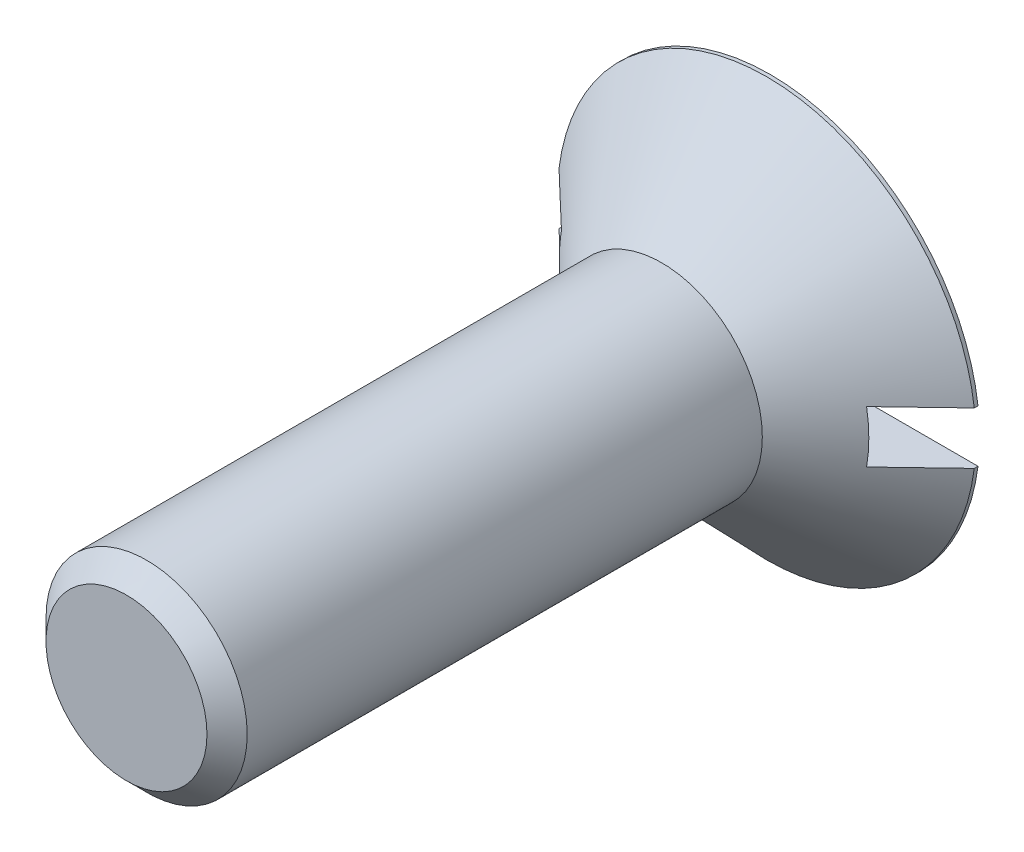
ISO-10303-21;
HEADER;
FILE_DESCRIPTION(('STEP AP214'),'2;1');
FILE_NAME('part.step','',(''),(''),'','','');
FILE_SCHEMA(('AUTOMOTIVE_DESIGN { 1 0 10303 214 1 1 1 1 }'));
ENDSEC;
DATA;
#1=APPLICATION_CONTEXT('core data for automotive mechanical design processes');
#2=APPLICATION_PROTOCOL_DEFINITION('international standard','automotive_design',2000,#1);
#3=PRODUCT_CONTEXT('',#1,'mechanical');
#4=PRODUCT('Part','Part','',(#3));
#5=PRODUCT_RELATED_PRODUCT_CATEGORY('part','',(#4));
#6=PRODUCT_DEFINITION_FORMATION('','',#4);
#7=PRODUCT_DEFINITION_CONTEXT('part definition',#1,'design');
#8=PRODUCT_DEFINITION('design','',#6,#7);
#9=PRODUCT_DEFINITION_SHAPE('','',#8);
#10=(LENGTH_UNIT() NAMED_UNIT(*) SI_UNIT(.MILLI.,.METRE.));
#11=(NAMED_UNIT(*) PLANE_ANGLE_UNIT() SI_UNIT($,.RADIAN.));
#12=(NAMED_UNIT(*) SI_UNIT($,.STERADIAN.) SOLID_ANGLE_UNIT());
#13=UNCERTAINTY_MEASURE_WITH_UNIT(LENGTH_MEASURE(1.E-05),#10,'distance_accuracy_value','');
#14=(GEOMETRIC_REPRESENTATION_CONTEXT(3) GLOBAL_UNCERTAINTY_ASSIGNED_CONTEXT((#13)) GLOBAL_UNIT_ASSIGNED_CONTEXT((#10,
#11,#12)) REPRESENTATION_CONTEXT('',''));
#15=CARTESIAN_POINT('',(0.,0.,0.));
#16=DIRECTION('',(0.,0.,1.));
#17=DIRECTION('',(1.,0.,0.));
#18=AXIS2_PLACEMENT_3D('',#15,#16,#17);
#19=CARTESIAN_POINT('',(0.,0.,-2.7));
#20=DIRECTION('',(0.,0.,1.));
#21=DIRECTION('',(1.,0.,0.));
#22=AXIS2_PLACEMENT_3D('',#19,#20,#21);
#23=PLANE('',#22);
#24=DIRECTION('',(1.,0.,0.));
#25=VECTOR('',#24,1.);
#26=CARTESIAN_POINT('',(-5.2,-0.65,-2.7));
#27=LINE('',#26,#25);
#28=CARTESIAN_POINT('',(-5.15921505657595,-0.65,-2.7));
#29=VERTEX_POINT('',#28);
#30=CARTESIAN_POINT('',(5.15921505657595,-0.65,-2.7));
#31=VERTEX_POINT('',#30);
#32=EDGE_CURVE('E126',#29,#31,#27,.T.);
#33=ORIENTED_EDGE('',*,*,#32,.T.);
#34=CARTESIAN_POINT('',(0.,0.,-2.7));
#35=DIRECTION('',(0.,0.,-1.));
#36=DIRECTION('',(-1.,0.,0.));
#37=AXIS2_PLACEMENT_3D('',#34,#35,#36);
#38=CIRCLE('',#37,5.2);
#39=EDGE_CURVE('E109',#31,#29,#38,.T.);
#40=ORIENTED_EDGE('',*,*,#39,.T.);
#41=EDGE_LOOP('',(#33,#40));
#42=FACE_BOUND('',#41,.T.);
#43=ADVANCED_FACE('F30',(#42),#23,.F.);
#44=DIRECTION('',(-1.,0.,0.));
#45=VECTOR('',#44,1.);
#46=CARTESIAN_POINT('',(-5.2,0.65,-2.7));
#47=LINE('',#46,#45);
#48=CARTESIAN_POINT('',(5.15921505657595,0.65,-2.7));
#49=VERTEX_POINT('',#48);
#50=CARTESIAN_POINT('',(-5.15921505657595,0.65,-2.7));
#51=VERTEX_POINT('',#50);
#52=EDGE_CURVE('E97',#49,#51,#47,.T.);
#53=ORIENTED_EDGE('',*,*,#52,.T.);
#54=EDGE_CURVE('E106',#51,#49,#38,.T.);
#55=ORIENTED_EDGE('',*,*,#54,.T.);
#56=EDGE_LOOP('',(#53,#55));
#57=FACE_BOUND('',#56,.T.);
#58=ADVANCED_FACE('F150',(#57),#23,.F.);
#59=CARTESIAN_POINT('',(0.,0.,0.));
#60=DIRECTION('',(0.,0.,-1.));
#61=DIRECTION('',(-1.,0.,0.));
#62=AXIS2_PLACEMENT_3D('',#59,#60,#61);
#63=CYLINDRICAL_SURFACE('',#62,5.2);
#64=DIRECTION('',(0.,0.,-1.));
#65=VECTOR('',#64,1.);
#66=CARTESIAN_POINT('',(5.15921505657595,-0.65,0.));
#67=LINE('',#66,#65);
#68=CARTESIAN_POINT('',(5.15921505657595,-0.65,-2.60735969197909));
#69=VERTEX_POINT('',#68);
#70=EDGE_CURVE('E119',#69,#31,#67,.T.);
#71=ORIENTED_EDGE('',*,*,#70,.F.);
#72=CARTESIAN_POINT('',(0.,0.,-2.60735969197909));
#73=DIRECTION('',(0.,0.,-1.));
#74=DIRECTION('',(-1.,0.,0.));
#75=AXIS2_PLACEMENT_3D('',#72,#73,#74);
#76=CIRCLE('',#75,5.2);
#77=CARTESIAN_POINT('',(-5.15921505657595,-0.65,-2.60735969197909));
#78=VERTEX_POINT('',#77);
#79=EDGE_CURVE('E116',#69,#78,#76,.T.);
#80=ORIENTED_EDGE('',*,*,#79,.T.);
#81=DIRECTION('',(0.,0.,-1.));
#82=VECTOR('',#81,1.);
#83=CARTESIAN_POINT('',(-5.15921505657595,-0.65,0.));
#84=LINE('',#83,#82);
#85=EDGE_CURVE('E53',#29,#78,#84,.F.);
#86=ORIENTED_EDGE('',*,*,#85,.F.);
#87=ORIENTED_EDGE('',*,*,#39,.F.);
#88=EDGE_LOOP('',(#71,#80,#86,#87));
#89=FACE_BOUND('',#88,.T.);
#90=ADVANCED_FACE('F145',(#89),#63,.T.);
#91=DIRECTION('',(0.,0.,-1.));
#92=VECTOR('',#91,1.);
#93=CARTESIAN_POINT('',(-5.15921505657595,0.65,0.));
#94=LINE('',#93,#92);
#95=CARTESIAN_POINT('',(-5.15921505657595,0.65,-2.60735969197909));
#96=VERTEX_POINT('',#95);
#97=EDGE_CURVE('E123',#96,#51,#94,.T.);
#98=ORIENTED_EDGE('',*,*,#97,.F.);
#99=CARTESIAN_POINT('',(5.15921505657595,0.65,-2.60735969197909));
#100=VERTEX_POINT('',#99);
#101=EDGE_CURVE('E114',#96,#100,#76,.T.);
#102=ORIENTED_EDGE('',*,*,#101,.T.);
#103=DIRECTION('',(0.,0.,-1.));
#104=VECTOR('',#103,1.);
#105=CARTESIAN_POINT('',(5.15921505657595,0.65,0.));
#106=LINE('',#105,#104);
#107=EDGE_CURVE('E121',#49,#100,#106,.F.);
#108=ORIENTED_EDGE('',*,*,#107,.F.);
#109=ORIENTED_EDGE('',*,*,#54,.F.);
#110=EDGE_LOOP('',(#98,#102,#108,#109));
#111=FACE_BOUND('',#110,.T.);
#112=ADVANCED_FACE('F137',(#111),#63,.T.);
#113=CARTESIAN_POINT('',(0.,0.,0.));
#114=DIRECTION('',(0.,0.,-1.));
#115=DIRECTION('',(-1.,0.,0.));
#116=AXIS2_PLACEMENT_3D('',#113,#114,#115);
#117=CONICAL_SURFACE('',#116,2.5,0.802851455917393);
#118=CARTESIAN_POINT('',(0.,0.,0.));
#119=DIRECTION('',(0.,0.,1.));
#120=DIRECTION('',(1.,0.,0.));
#121=AXIS2_PLACEMENT_3D('',#118,#119,#120);
#122=CIRCLE('',#121,2.5);
#123=CARTESIAN_POINT('',(2.5,0.,0.));
#124=VERTEX_POINT('',#123);
#125=EDGE_CURVE('E129',#124,#124,#122,.T.);
#126=ORIENTED_EDGE('',*,*,#125,.F.);
#127=EDGE_LOOP('',(#126));
#128=FACE_BOUND('',#127,.T.);
#129=CARTESIAN_POINT('',(-11.4893102845407,-0.65,-8.69861763784645));
#130=CARTESIAN_POINT('',(-11.0936322693359,-0.65,-8.31713063269292));
#131=CARTESIAN_POINT('',(-10.6979273596677,-0.65,-7.93567150904476));
#132=CARTESIAN_POINT('',(-9.90642369953296,-0.65,-7.17283943787307));
#133=CARTESIAN_POINT('',(-9.51062494781922,-0.65,-6.79146649164373));
#134=CARTESIAN_POINT('',(-8.71878349071496,-0.65,-6.02873118687271));
#135=CARTESIAN_POINT('',(-8.32274074773519,-0.65,-5.64736886734937));
#136=CARTESIAN_POINT('',(-7.53047315752336,-0.65,-4.88484438614053));
#137=CARTESIAN_POINT('',(-7.13424831288356,-0.65,-4.50368222176172));
#138=CARTESIAN_POINT('',(-6.32991311690129,-0.65,-3.73052859814336));
#139=CARTESIAN_POINT('',(-5.92179393903179,-0.65,-3.33854631686012));
#140=CARTESIAN_POINT('',(-5.30917211296448,-0.65,-2.75101711327629));
#141=CARTESIAN_POINT('',(-5.10488657239694,-0.65,-2.55524385345618));
#142=CARTESIAN_POINT('',(-4.69610731293476,-0.65,-2.16391662081135));
#143=CARTESIAN_POINT('',(-4.49161359498753,-0.65,-1.96836264699711));
#144=CARTESIAN_POINT('',(-4.08235923966884,-0.65,-1.57761458414471));
#145=CARTESIAN_POINT('',(-3.87759866268909,-0.65,-1.38242043190242));
#146=CARTESIAN_POINT('',(-3.46758916180833,-0.65,-0.992538602363089));
#147=CARTESIAN_POINT('',(-3.26234022955605,-0.65,-0.79785093384826));
#148=CARTESIAN_POINT('',(-2.85105146739575,-0.65,-0.409341773840862));
#149=CARTESIAN_POINT('',(-2.6450116993248,-0.65,-0.215520217090633));
#150=CARTESIAN_POINT('',(-2.33477603531432,-0.65,0.0739468701253725));
#151=CARTESIAN_POINT('',(-2.23116959679678,-0.65,0.170223692183274));
#152=CARTESIAN_POINT('',(-2.02336995867639,-0.65,0.362141520498095));
#153=CARTESIAN_POINT('',(-1.91917676529978,-0.65,0.45778253347837));
#154=CARTESIAN_POINT('',(-1.76104324134895,-0.65,0.60154069005875));
#155=CARTESIAN_POINT('',(-1.70744122498732,-0.65,0.650029740293317));
#156=CARTESIAN_POINT('',(-1.59992446047125,-0.65,0.746661684282614));
#157=CARTESIAN_POINT('',(-1.5460097079256,-0.65,0.79480457315544));
#158=CARTESIAN_POINT('',(-1.43790592992909,-0.65,0.890511100336939));
#159=CARTESIAN_POINT('',(-1.3837179179759,-0.65,0.938075880158892));
#160=CARTESIAN_POINT('',(-1.27479283347461,-0.65,1.03256883007247));
#161=CARTESIAN_POINT('',(-1.2200557771366,-0.65,1.07949701886326));
#162=CARTESIAN_POINT('',(-1.09383957161181,-0.65,1.18594977245332));
#163=CARTESIAN_POINT('',(-1.02210916750861,-0.65,1.24518007450695));
#164=CARTESIAN_POINT('',(-0.912827335728474,-0.65,1.33224695596647));
#165=CARTESIAN_POINT('',(-0.876035543814573,-0.65,1.36103467187658));
#166=CARTESIAN_POINT('',(-0.801777163334481,-0.65,1.41772357829757));
#167=CARTESIAN_POINT('',(-0.764310637198629,-0.65,1.44562485017379));
#168=CARTESIAN_POINT('',(-0.688104791439321,-0.65,1.50046629655638));
#169=CARTESIAN_POINT('',(-0.649356501873798,-0.65,1.52739410280789));
#170=CARTESIAN_POINT('',(-0.570600779127031,-0.65,1.5794415119517));
#171=CARTESIAN_POINT('',(-0.530592263669161,-0.65,1.60455949616956));
#172=CARTESIAN_POINT('',(-0.449153284442039,-0.65,1.65188621912339));
#173=CARTESIAN_POINT('',(-0.407731974747176,-0.65,1.67411037260073));
#174=CARTESIAN_POINT('',(-0.322899575395543,-0.65,1.7142514401532));
#175=CARTESIAN_POINT('',(-0.27949277862375,-0.65,1.73217716826498));
#176=CARTESIAN_POINT('',(-0.189519028833581,-0.65,1.76166785761278));
#177=CARTESIAN_POINT('',(-0.142909011358132,-0.65,1.77311143571208));
#178=CARTESIAN_POINT('',(-0.0721249030591222,-0.65,1.78307628434284));
#179=CARTESIAN_POINT('',(-0.0484462433274801,-0.65,1.78520144895712));
#180=CARTESIAN_POINT('',(-0.000992017065605612,-0.65,1.78693954584078));
#181=CARTESIAN_POINT('',(0.0227835459764063,-0.65,1.78655256775517));
#182=CARTESIAN_POINT('',(0.0701110726322917,-0.65,1.78329485459094));
#183=CARTESIAN_POINT('',(0.0936633892440285,-0.65,1.78042910602846));
#184=CARTESIAN_POINT('',(0.140383070139763,-0.65,1.77243612376124));
#185=CARTESIAN_POINT('',(0.163550270076254,-0.65,1.76730794904047));
#186=CARTESIAN_POINT('',(0.209519509873833,-0.65,1.75506871237489));
#187=CARTESIAN_POINT('',(0.23231786284107,-0.65,1.74794403375241));
#188=CARTESIAN_POINT('',(0.277332282162851,-0.65,1.73207762766873));
#189=CARTESIAN_POINT('',(0.299548424465859,-0.65,1.72333611233218));
#190=CARTESIAN_POINT('',(0.358746125598081,-0.65,1.697996123933));
#191=CARTESIAN_POINT('',(0.395201521492987,-0.65,1.68017470488186));
#192=CARTESIAN_POINT('',(0.466764775957409,-0.65,1.64198476699881));
#193=CARTESIAN_POINT('',(0.501871124437707,-0.65,1.62161349658608));
#194=CARTESIAN_POINT('',(0.571113171793036,-0.65,1.57905164746661));
#195=CARTESIAN_POINT('',(0.605245275625463,-0.65,1.55685527345049));
#196=CARTESIAN_POINT('',(0.672665714631114,-0.65,1.5112101406464));
#197=CARTESIAN_POINT('',(0.705953838882783,-0.65,1.48776107325574));
#198=CARTESIAN_POINT('',(0.805465969277591,-0.65,1.41562231679818));
#199=CARTESIAN_POINT('',(0.870689775422945,-0.65,1.36555894713207));
#200=CARTESIAN_POINT('',(0.999351030462129,-0.65,1.26351893643115));
#201=CARTESIAN_POINT('',(1.0627922167411,-0.65,1.21154692301138));
#202=CARTESIAN_POINT('',(1.18727260498139,-0.65,1.10744522977425));
#203=CARTESIAN_POINT('',(1.24833421225722,-0.65,1.05534228143086));
#204=CARTESIAN_POINT('',(1.36975111188385,-0.65,0.950320330644302));
#205=CARTESIAN_POINT('',(1.43010638569284,-0.65,0.897401306862655));
#206=CARTESIAN_POINT('',(1.61044422444324,-0.65,0.737788691135814));
#207=CARTESIAN_POINT('',(1.72968144842965,-0.65,0.630254350019406));
#208=CARTESIAN_POINT('',(1.96719711166367,-0.65,0.413858489109734));
#209=CARTESIAN_POINT('',(2.08547424609227,-0.65,0.304995546555718));
#210=CARTESIAN_POINT('',(2.32133234240377,-0.65,0.0865372287163224));
#211=CARTESIAN_POINT('',(2.43891335903559,-0.65,-0.023058087485757));
#212=CARTESIAN_POINT('',(2.67240996259067,-0.65,-0.241590980741517));
#213=CARTESIAN_POINT('',(2.78833018521473,-0.65,-0.350523612861176));
#214=CARTESIAN_POINT('',(3.01986544448064,-0.65,-0.568717386614953));
#215=CARTESIAN_POINT('',(3.13548047476018,-0.65,-0.677978534997628));
#216=CARTESIAN_POINT('',(3.48188566806947,-0.65,-1.00600121777694));
#217=CARTESIAN_POINT('',(3.71234876520859,-0.65,-1.2251079831423));
#218=CARTESIAN_POINT('',(4.25529027560235,-0.65,-1.74243989773672));
#219=CARTESIAN_POINT('',(4.56756352240365,-0.65,-2.04088011657262));
#220=CARTESIAN_POINT('',(5.19162878065063,-0.65,-2.63826499918659));
#221=CARTESIAN_POINT('',(5.50342079052533,-0.65,-2.93720966460478));
#222=CARTESIAN_POINT('',(6.43850481575187,-0.65,-3.8346072187683));
#223=CARTESIAN_POINT('',(7.06137498907276,-0.65,-4.43349952852174));
#224=CARTESIAN_POINT('',(8.3186479400382,-0.65,-5.64333413062595));
#225=CARTESIAN_POINT('',(8.95304144640194,-0.65,-6.25428604987556));
#226=CARTESIAN_POINT('',(9.90435870993064,-0.65,-7.17085896932446));
#227=CARTESIAN_POINT('',(10.2213844226308,-0.65,-7.47637413869438));
#228=CARTESIAN_POINT('',(10.8553830765419,-0.65,-8.08745896527287));
#229=CARTESIAN_POINT('',(11.1723560177747,-0.65,-8.39302862245877));
#230=CARTESIAN_POINT('',(11.4893102845407,-0.65,-8.69861763784645));
#231=B_SPLINE_CURVE_WITH_KNOTS('',3,(#129,#130,#131,#132,#133,#134,#135,#136,#137,#138,#139,
#140,#141,#142,#143,#144,#145,#146,#147,#148,#149,#150,#151,#152,#153,#154,#155,#156,#157,#158,
#159,#160,#161,#162,#163,#164,#165,#166,#167,#168,#169,#170,#171,#172,#173,#174,#175,#176,#177,
#178,#179,#180,#181,#182,#183,#184,#185,#186,#187,#188,#189,#190,#191,#192,#193,#194,#195,#196,
#197,#198,#199,#200,#201,#202,#203,#204,#205,#206,#207,#208,#209,#210,#211,#212,#213,#214,#215,
#216,#217,#218,#219,#220,#221,#222,#223,#224,#225,#226,#227,#228,#229,#230),.UNSPECIFIED.,.F.,
.F.,(4,2,2,2,2,2,2,2,2,2,2,2,2,2,2,2,2,2,2,2,2,2,2,2,2,2,2,2,2,2,2,2,2,2,2,2,2,2,2,2,2,2,2,2,2,
2,2,2,2,2,4),(0.,1.64889080307027,3.29780491126979,4.94722404851164,6.59662039123902,
8.29423665197053,9.14308149181302,9.99192248569707,10.8405965696876,11.6892852725264,
12.5379089142175,12.9622089138893,13.386504419647,13.6033425632958,13.8201837590317,
14.0364865068738,14.2527828872394,14.5318133692632,14.6719515532886,14.8120768368619,
14.953600342318,15.0952488920022,15.2361090234289,15.3766777989644,15.51979850082,
15.5910000912053,15.6621991407989,15.7332552922645,15.8043410261802,15.8759239044988,
15.9474973979878,16.0690671785401,16.19076929643,16.3128740018617,16.4350089279251,
16.6815880535715,16.9276043908358,17.1684019898686,17.4092058959149,17.8908821190332,
18.3731296030605,18.8553386410908,19.3325531026746,19.8097774353603,20.7637616804972,
22.0596119194311,23.3554663797315,25.947714196252,28.5899587297178,29.9107930730773,
31.2316268681944),.UNSPECIFIED.);
#232=CARTESIAN_POINT('',(-3.79086704615917,-0.65,-1.3));
#233=VERTEX_POINT('',#232);
#234=EDGE_CURVE('E81',#78,#233,#231,.T.);
#235=ORIENTED_EDGE('',*,*,#234,.F.);
#236=ORIENTED_EDGE('',*,*,#79,.F.);
#237=CARTESIAN_POINT('',(3.79086704615917,-0.65,-1.3));
#238=VERTEX_POINT('',#237);
#239=EDGE_CURVE('E92',#238,#69,#231,.T.);
#240=ORIENTED_EDGE('',*,*,#239,.F.);
#241=CARTESIAN_POINT('',(0.,0.,-1.3));
#242=DIRECTION('',(0.,0.,1.));
#243=DIRECTION('',(1.,0.,0.));
#244=AXIS2_PLACEMENT_3D('',#241,#242,#243);
#245=CIRCLE('',#244,3.84618940792774);
#246=CARTESIAN_POINT('',(3.79086704615917,0.65,-1.3));
#247=VERTEX_POINT('',#246);
#248=EDGE_CURVE('E96',#238,#247,#245,.T.);
#249=ORIENTED_EDGE('',*,*,#248,.T.);
#250=CARTESIAN_POINT('',(11.4893102845407,0.65,-8.69861763784645));
#251=CARTESIAN_POINT('',(11.0936322693359,0.65,-8.31713063269292));
#252=CARTESIAN_POINT('',(10.6979273596677,0.65,-7.93567150904476));
#253=CARTESIAN_POINT('',(9.90642369953296,0.65,-7.17283943787307));
#254=CARTESIAN_POINT('',(9.51062494781922,0.65,-6.79146649164374));
#255=CARTESIAN_POINT('',(8.71878349071497,0.65,-6.02873118687271));
#256=CARTESIAN_POINT('',(8.3227407477352,0.65,-5.64736886734938));
#257=CARTESIAN_POINT('',(7.53047315752336,0.65,-4.88484438614053));
#258=CARTESIAN_POINT('',(7.13424831288356,0.65,-4.50368222176173));
#259=CARTESIAN_POINT('',(6.32991311690129,0.65,-3.73052859814336));
#260=CARTESIAN_POINT('',(5.9217939390318,0.65,-3.33854631686013));
#261=CARTESIAN_POINT('',(5.30917211296449,0.65,-2.7510171132763));
#262=CARTESIAN_POINT('',(5.10488657239695,0.65,-2.55524385345618));
#263=CARTESIAN_POINT('',(4.69610731293477,0.65,-2.16391662081136));
#264=CARTESIAN_POINT('',(4.49161359498754,0.65,-1.96836264699711));
#265=CARTESIAN_POINT('',(4.08235923966884,0.65,-1.57761458414471));
#266=CARTESIAN_POINT('',(3.87759866268909,0.65,-1.38242043190242));
#267=CARTESIAN_POINT('',(3.46758916180833,0.65,-0.992538602363092));
#268=CARTESIAN_POINT('',(3.26234022955605,0.65,-0.797850933848262));
#269=CARTESIAN_POINT('',(2.85105146739575,0.65,-0.409341773840863));
#270=CARTESIAN_POINT('',(2.6450116993248,0.65,-0.215520217090634));
#271=CARTESIAN_POINT('',(2.33477603531432,0.65,0.0739468701253719));
#272=CARTESIAN_POINT('',(2.23116959679678,0.65,0.170223692183273));
#273=CARTESIAN_POINT('',(2.02336995867639,0.65,0.362141520498095));
#274=CARTESIAN_POINT('',(1.91917676529978,0.65,0.45778253347837));
#275=CARTESIAN_POINT('',(1.76104324134895,0.65,0.60154069005875));
#276=CARTESIAN_POINT('',(1.70744122498732,0.65,0.650029740293317));
#277=CARTESIAN_POINT('',(1.59992446047125,0.65,0.746661684282614));
#278=CARTESIAN_POINT('',(1.5460097079256,0.65,0.794804573155441));
#279=CARTESIAN_POINT('',(1.43790592992909,0.65,0.890511100336939));
#280=CARTESIAN_POINT('',(1.3837179179759,0.65,0.938075880158892));
#281=CARTESIAN_POINT('',(1.27479283347461,0.65,1.03256883007247));
#282=CARTESIAN_POINT('',(1.2200557771366,0.65,1.07949701886326));
#283=CARTESIAN_POINT('',(1.09383957161181,0.65,1.18594977245332));
#284=CARTESIAN_POINT('',(1.02210916750861,0.65,1.24518007450695));
#285=CARTESIAN_POINT('',(0.912827335728473,0.65,1.33224695596647));
#286=CARTESIAN_POINT('',(0.876035543814572,0.65,1.36103467187658));
#287=CARTESIAN_POINT('',(0.801777163334481,0.65,1.41772357829757));
#288=CARTESIAN_POINT('',(0.764310637198628,0.65,1.44562485017379));
#289=CARTESIAN_POINT('',(0.688104791439321,0.65,1.50046629655638));
#290=CARTESIAN_POINT('',(0.649356501873797,0.65,1.52739410280789));
#291=CARTESIAN_POINT('',(0.57060077912703,0.65,1.5794415119517));
#292=CARTESIAN_POINT('',(0.53059226366916,0.65,1.60455949616956));
#293=CARTESIAN_POINT('',(0.449153284442039,0.65,1.65188621912339));
#294=CARTESIAN_POINT('',(0.407731974747176,0.65,1.67411037260073));
#295=CARTESIAN_POINT('',(0.322899575395543,0.65,1.7142514401532));
#296=CARTESIAN_POINT('',(0.279492778623749,0.65,1.73217716826498));
#297=CARTESIAN_POINT('',(0.189519028833581,0.65,1.76166785761278));
#298=CARTESIAN_POINT('',(0.142909011358132,0.65,1.77311143571208));
#299=CARTESIAN_POINT('',(0.0721249030591215,0.65,1.78307628434284));
#300=CARTESIAN_POINT('',(0.0484462433274795,0.65,1.78520144895712));
#301=CARTESIAN_POINT('',(0.000992017065604914,0.65,1.78693954584078));
#302=CARTESIAN_POINT('',(-0.022783545976407,0.65,1.78655256775517));
#303=CARTESIAN_POINT('',(-0.0701110726322924,0.65,1.78329485459094));
#304=CARTESIAN_POINT('',(-0.0936633892440292,0.65,1.78042910602846));
#305=CARTESIAN_POINT('',(-0.140383070139763,0.65,1.77243612376124));
#306=CARTESIAN_POINT('',(-0.163550270076255,0.65,1.76730794904047));
#307=CARTESIAN_POINT('',(-0.209519509873834,0.65,1.75506871237489));
#308=CARTESIAN_POINT('',(-0.232317862841071,0.65,1.74794403375241));
#309=CARTESIAN_POINT('',(-0.277332282162852,0.65,1.73207762766873));
#310=CARTESIAN_POINT('',(-0.29954842446586,0.65,1.72333611233218));
#311=CARTESIAN_POINT('',(-0.358746125598082,0.65,1.697996123933));
#312=CARTESIAN_POINT('',(-0.395201521492989,0.65,1.68017470488186));
#313=CARTESIAN_POINT('',(-0.466764775957412,0.65,1.6419847669988));
#314=CARTESIAN_POINT('',(-0.50187112443771,0.65,1.62161349658608));
#315=CARTESIAN_POINT('',(-0.571113171793038,0.65,1.57905164746661));
#316=CARTESIAN_POINT('',(-0.605245275625464,0.65,1.55685527345049));
#317=CARTESIAN_POINT('',(-0.672665714631115,0.65,1.51121014064639));
#318=CARTESIAN_POINT('',(-0.705953838882785,0.65,1.48776107325574));
#319=CARTESIAN_POINT('',(-0.805465969277593,0.65,1.41562231679817));
#320=CARTESIAN_POINT('',(-0.870689775422947,0.65,1.36555894713207));
#321=CARTESIAN_POINT('',(-0.999351030462131,0.65,1.26351893643115));
#322=CARTESIAN_POINT('',(-1.06279221674111,0.65,1.21154692301138));
#323=CARTESIAN_POINT('',(-1.18727260498139,0.65,1.10744522977425));
#324=CARTESIAN_POINT('',(-1.24833421225722,0.65,1.05534228143085));
#325=CARTESIAN_POINT('',(-1.36975111188385,0.65,0.950320330644297));
#326=CARTESIAN_POINT('',(-1.43010638569284,0.65,0.89740130686265));
#327=CARTESIAN_POINT('',(-1.61044422444325,0.65,0.737788691135807));
#328=CARTESIAN_POINT('',(-1.72968144842966,0.65,0.630254350019398));
#329=CARTESIAN_POINT('',(-1.96719711166368,0.65,0.413858489109724));
#330=CARTESIAN_POINT('',(-2.08547424609228,0.65,0.304995546555709));
#331=CARTESIAN_POINT('',(-2.32133234240378,0.65,0.0865372287163127));
#332=CARTESIAN_POINT('',(-2.4389133590356,0.65,-0.0230580874857675));
#333=CARTESIAN_POINT('',(-2.67240996259068,0.65,-0.241590980741528));
#334=CARTESIAN_POINT('',(-2.78833018521474,0.65,-0.350523612861188));
#335=CARTESIAN_POINT('',(-3.01986544448066,0.65,-0.568717386614966));
#336=CARTESIAN_POINT('',(-3.13548047476019,0.65,-0.67797853499764));
#337=CARTESIAN_POINT('',(-3.48188566806949,0.65,-1.00600121777695));
#338=CARTESIAN_POINT('',(-3.7123487652086,0.65,-1.22510798314231));
#339=CARTESIAN_POINT('',(-4.25529027560237,0.65,-1.74243989773674));
#340=CARTESIAN_POINT('',(-4.56756352240367,0.65,-2.04088011657263));
#341=CARTESIAN_POINT('',(-5.19162878065065,0.65,-2.6382649991866));
#342=CARTESIAN_POINT('',(-5.50342079052534,0.65,-2.93720966460479));
#343=CARTESIAN_POINT('',(-6.43850481575188,0.65,-3.83460721876831));
#344=CARTESIAN_POINT('',(-7.06137498907276,0.65,-4.43349952852175));
#345=CARTESIAN_POINT('',(-8.3186479400382,0.65,-5.64333413062596));
#346=CARTESIAN_POINT('',(-8.95304144640194,0.65,-6.25428604987556));
#347=CARTESIAN_POINT('',(-9.90435870993064,0.65,-7.17085896932446));
#348=CARTESIAN_POINT('',(-10.2213844226308,0.65,-7.47637413869438));
#349=CARTESIAN_POINT('',(-10.8553830765419,0.65,-8.08745896527287));
#350=CARTESIAN_POINT('',(-11.1723560177747,0.65,-8.39302862245877));
#351=CARTESIAN_POINT('',(-11.4893102845407,0.65,-8.69861763784645));
#352=B_SPLINE_CURVE_WITH_KNOTS('',3,(#250,#251,#252,#253,#254,#255,#256,#257,#258,#259,#260,
#261,#262,#263,#264,#265,#266,#267,#268,#269,#270,#271,#272,#273,#274,#275,#276,#277,#278,#279,
#280,#281,#282,#283,#284,#285,#286,#287,#288,#289,#290,#291,#292,#293,#294,#295,#296,#297,#298,
#299,#300,#301,#302,#303,#304,#305,#306,#307,#308,#309,#310,#311,#312,#313,#314,#315,#316,#317,
#318,#319,#320,#321,#322,#323,#324,#325,#326,#327,#328,#329,#330,#331,#332,#333,#334,#335,#336,
#337,#338,#339,#340,#341,#342,#343,#344,#345,#346,#347,#348,#349,#350,#351),.UNSPECIFIED.,.F.,
.F.,(4,2,2,2,2,2,2,2,2,2,2,2,2,2,2,2,2,2,2,2,2,2,2,2,2,2,2,2,2,2,2,2,2,2,2,2,2,2,2,2,2,2,2,2,2,
2,2,2,2,2,4),(0.,1.64889080307026,3.29780491126978,4.94722404851163,6.59662039123901,
8.29423665197052,9.14308149181302,9.99192248569706,10.8405965696876,11.6892852725264,
12.5379089142175,12.9622089138893,13.386504419647,13.6033425632958,13.8201837590317,
14.0364865068738,14.2527828872394,14.5318133692632,14.6719515532886,14.8120768368619,
14.953600342318,15.0952488920022,15.2361090234289,15.3766777989644,15.51979850082,
15.5910000912053,15.6621991407989,15.7332552922645,15.8043410261802,15.8759239044988,
15.9474973979878,16.0690671785401,16.19076929643,16.3128740018617,16.4350089279251,
16.6815880535715,16.9276043908358,17.1684019898686,17.4092058959149,17.8908821190332,
18.3731296030605,18.8553386410908,19.3325531026746,19.8097774353603,20.7637616804973,
22.0596119194311,23.3554663797315,25.947714196252,28.5899587297178,29.9107930730773,
31.2316268681944),.UNSPECIFIED.);
#353=EDGE_CURVE('E104',#100,#247,#352,.T.);
#354=ORIENTED_EDGE('',*,*,#353,.F.);
#355=ORIENTED_EDGE('',*,*,#101,.F.);
#356=CARTESIAN_POINT('',(-3.79086704615917,0.65,-1.3));
#357=VERTEX_POINT('',#356);
#358=EDGE_CURVE('E90',#357,#96,#352,.T.);
#359=ORIENTED_EDGE('',*,*,#358,.F.);
#360=EDGE_CURVE('E94',#357,#233,#245,.T.);
#361=ORIENTED_EDGE('',*,*,#360,.T.);
#362=EDGE_LOOP('',(#235,#236,#240,#249,#354,#355,#359,#361));
#363=FACE_BOUND('',#362,.T.);
#364=ADVANCED_FACE('F100',(#128,#363),#117,.T.);
#365=CARTESIAN_POINT('',(-5.2,-0.65,-1.3));
#366=DIRECTION('',(0.,1.,0.));
#367=DIRECTION('',(-1.,0.,0.));
#368=AXIS2_PLACEMENT_3D('',#365,#366,#367);
#369=PLANE('',#368);
#370=ORIENTED_EDGE('',*,*,#85,.T.);
#371=ORIENTED_EDGE('',*,*,#234,.T.);
#372=DIRECTION('',(1.,0.,0.));
#373=VECTOR('',#372,1.);
#374=CARTESIAN_POINT('',(-5.2,-0.65,-1.3));
#375=LINE('',#374,#373);
#376=EDGE_CURVE('E84',#233,#238,#375,.T.);
#377=ORIENTED_EDGE('',*,*,#376,.T.);
#378=ORIENTED_EDGE('',*,*,#239,.T.);
#379=ORIENTED_EDGE('',*,*,#70,.T.);
#380=ORIENTED_EDGE('',*,*,#32,.F.);
#381=EDGE_LOOP('',(#370,#371,#377,#378,#379,#380));
#382=FACE_BOUND('',#381,.T.);
#383=ADVANCED_FACE('F83',(#382),#369,.T.);
#384=CARTESIAN_POINT('',(-5.2,0.65,-1.3));
#385=DIRECTION('',(0.,-1.,0.));
#386=DIRECTION('',(0.,0.,-1.));
#387=AXIS2_PLACEMENT_3D('',#384,#385,#386);
#388=PLANE('',#387);
#389=ORIENTED_EDGE('',*,*,#107,.T.);
#390=ORIENTED_EDGE('',*,*,#353,.T.);
#391=DIRECTION('',(-1.,0.,0.));
#392=VECTOR('',#391,1.);
#393=CARTESIAN_POINT('',(-5.2,0.65,-1.3));
#394=LINE('',#393,#392);
#395=EDGE_CURVE('E45',#247,#357,#394,.T.);
#396=ORIENTED_EDGE('',*,*,#395,.T.);
#397=ORIENTED_EDGE('',*,*,#358,.T.);
#398=ORIENTED_EDGE('',*,*,#97,.T.);
#399=ORIENTED_EDGE('',*,*,#52,.F.);
#400=EDGE_LOOP('',(#389,#390,#396,#397,#398,#399));
#401=FACE_BOUND('',#400,.T.);
#402=ADVANCED_FACE('F143',(#401),#388,.T.);
#403=CARTESIAN_POINT('',(-5.2,0.65,-1.3));
#404=DIRECTION('',(0.,0.,1.));
#405=DIRECTION('',(1.,0.,0.));
#406=AXIS2_PLACEMENT_3D('',#403,#404,#405);
#407=PLANE('',#406);
#408=ORIENTED_EDGE('',*,*,#395,.F.);
#409=ORIENTED_EDGE('',*,*,#248,.F.);
#410=ORIENTED_EDGE('',*,*,#376,.F.);
#411=ORIENTED_EDGE('',*,*,#360,.F.);
#412=EDGE_LOOP('',(#408,#409,#410,#411));
#413=FACE_BOUND('',#412,.T.);
#414=ADVANCED_FACE('F93',(#413),#407,.F.);
#415=CARTESIAN_POINT('',(0.,0.,13.3));
#416=DIRECTION('',(0.,0.,1.));
#417=DIRECTION('',(1.,0.,0.));
#418=AXIS2_PLACEMENT_3D('',#415,#416,#417);
#419=PLANE('',#418);
#420=CARTESIAN_POINT('',(0.,0.,13.3));
#421=DIRECTION('',(0.,0.,1.));
#422=DIRECTION('',(1.,0.,0.));
#423=AXIS2_PLACEMENT_3D('',#420,#421,#422);
#424=CIRCLE('',#423,2.);
#425=CARTESIAN_POINT('',(2.,0.,13.3));
#426=VERTEX_POINT('',#425);
#427=EDGE_CURVE('E38',#426,#426,#424,.T.);
#428=ORIENTED_EDGE('',*,*,#427,.T.);
#429=EDGE_LOOP('',(#428));
#430=FACE_BOUND('',#429,.T.);
#431=ADVANCED_FACE('F196',(#430),#419,.T.);
#432=CARTESIAN_POINT('',(0.,0.,0.));
#433=DIRECTION('',(0.,0.,1.));
#434=DIRECTION('',(1.,0.,0.));
#435=AXIS2_PLACEMENT_3D('',#432,#433,#434);
#436=CYLINDRICAL_SURFACE('',#435,2.5);
#437=CARTESIAN_POINT('',(0.,0.,12.8));
#438=DIRECTION('',(0.,0.,1.));
#439=DIRECTION('',(1.,0.,0.));
#440=AXIS2_PLACEMENT_3D('',#437,#438,#439);
#441=CIRCLE('',#440,2.5);
#442=CARTESIAN_POINT('',(2.5,0.,12.8));
#443=VERTEX_POINT('',#442);
#444=EDGE_CURVE('E11',#443,#443,#441,.F.);
#445=ORIENTED_EDGE('',*,*,#444,.T.);
#446=EDGE_LOOP('',(#445));
#447=FACE_BOUND('',#446,.T.);
#448=ORIENTED_EDGE('',*,*,#125,.T.);
#449=EDGE_LOOP('',(#448));
#450=FACE_BOUND('',#449,.T.);
#451=ADVANCED_FACE('F134',(#447,#450),#436,.T.);
#452=CARTESIAN_POINT('',(0.,0.,13.3));
#453=DIRECTION('',(0.,0.,-1.));
#454=DIRECTION('',(-1.,0.,0.));
#455=AXIS2_PLACEMENT_3D('',#452,#453,#454);
#456=CONICAL_SURFACE('',#455,2.,0.785398163397445);
#457=ORIENTED_EDGE('',*,*,#444,.F.);
#458=EDGE_LOOP('',(#457));
#459=FACE_BOUND('',#458,.T.);
#460=ORIENTED_EDGE('',*,*,#427,.F.);
#461=EDGE_LOOP('',(#460));
#462=FACE_BOUND('',#461,.T.);
#463=ADVANCED_FACE('F32',(#459,#462),#456,.T.);
#464=CLOSED_SHELL('',(#43,#58,#90,#112,#364,#383,#402,#414,#431,#451,#463));
#465=MANIFOLD_SOLID_BREP('B2',#464);
#466=ADVANCED_BREP_SHAPE_REPRESENTATION('',(#18,#465),#14);
#467=SHAPE_DEFINITION_REPRESENTATION(#9,#466);
ENDSEC;
END-ISO-10303-21;
